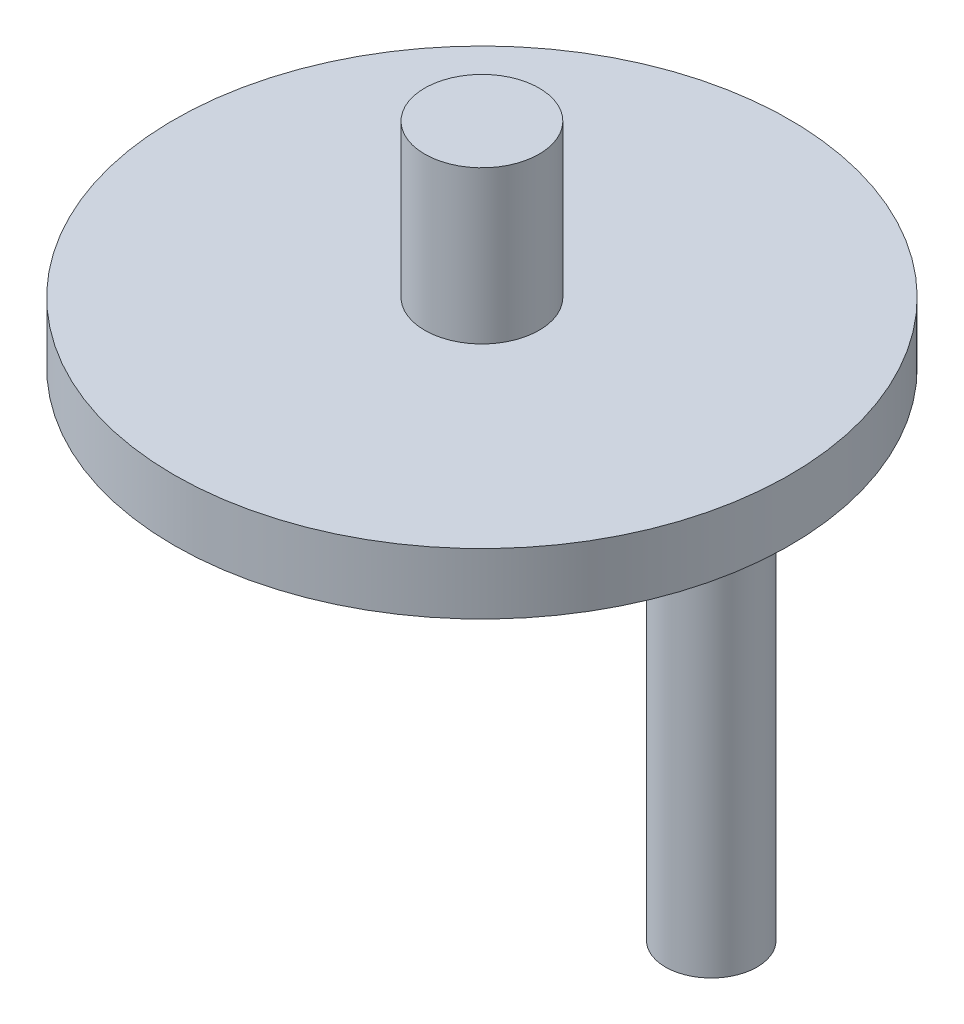
ISO-10303-21;
HEADER;
FILE_DESCRIPTION(('STEP AP214'),'2;1');
FILE_NAME('part.step','',(''),(''),'','','');
FILE_SCHEMA(('AUTOMOTIVE_DESIGN { 1 0 10303 214 1 1 1 1 }'));
ENDSEC;
DATA;
#1=APPLICATION_CONTEXT('core data for automotive mechanical design processes');
#2=APPLICATION_PROTOCOL_DEFINITION('international standard','automotive_design',2000,#1);
#3=PRODUCT_CONTEXT('',#1,'mechanical');
#4=PRODUCT('Part','Part','',(#3));
#5=PRODUCT_RELATED_PRODUCT_CATEGORY('part','',(#4));
#6=PRODUCT_DEFINITION_FORMATION('','',#4);
#7=PRODUCT_DEFINITION_CONTEXT('part definition',#1,'design');
#8=PRODUCT_DEFINITION('design','',#6,#7);
#9=PRODUCT_DEFINITION_SHAPE('','',#8);
#10=(LENGTH_UNIT() NAMED_UNIT(*) SI_UNIT(.MILLI.,.METRE.));
#11=(NAMED_UNIT(*) PLANE_ANGLE_UNIT() SI_UNIT($,.RADIAN.));
#12=(NAMED_UNIT(*) SI_UNIT($,.STERADIAN.) SOLID_ANGLE_UNIT());
#13=UNCERTAINTY_MEASURE_WITH_UNIT(LENGTH_MEASURE(1.E-05),#10,'distance_accuracy_value','');
#14=(GEOMETRIC_REPRESENTATION_CONTEXT(3) GLOBAL_UNCERTAINTY_ASSIGNED_CONTEXT((#13)) GLOBAL_UNIT_ASSIGNED_CONTEXT((#10,
#11,#12)) REPRESENTATION_CONTEXT('',''));
#15=CARTESIAN_POINT('',(0.,0.,0.));
#16=DIRECTION('',(0.,0.,1.));
#17=DIRECTION('',(1.,0.,0.));
#18=AXIS2_PLACEMENT_3D('',#15,#16,#17);
#19=CARTESIAN_POINT('',(0.,-8.,0.));
#20=DIRECTION('',(0.,1.,0.));
#21=DIRECTION('',(0.,0.,1.));
#22=AXIS2_PLACEMENT_3D('',#19,#20,#21);
#23=CYLINDRICAL_SURFACE('',#22,40.34);
#24=CARTESIAN_POINT('',(0.,-8.,0.));
#25=DIRECTION('',(0.,1.,0.));
#26=DIRECTION('',(0.,0.,1.));
#27=AXIS2_PLACEMENT_3D('',#24,#25,#26);
#28=CIRCLE('',#27,40.34);
#29=CARTESIAN_POINT('',(0.,-8.,40.34));
#30=VERTEX_POINT('',#29);
#31=EDGE_CURVE('E99',#30,#30,#28,.T.);
#32=ORIENTED_EDGE('',*,*,#31,.T.);
#33=EDGE_LOOP('',(#32));
#34=FACE_BOUND('',#33,.T.);
#35=CARTESIAN_POINT('',(0.,0.,0.));
#36=DIRECTION('',(0.,1.,0.));
#37=DIRECTION('',(0.,0.,1.));
#38=AXIS2_PLACEMENT_3D('',#35,#36,#37);
#39=CIRCLE('',#38,40.34);
#40=CARTESIAN_POINT('',(0.,0.,40.34));
#41=VERTEX_POINT('',#40);
#42=EDGE_CURVE('E95',#41,#41,#39,.T.);
#43=ORIENTED_EDGE('',*,*,#42,.F.);
#44=EDGE_LOOP('',(#43));
#45=FACE_BOUND('',#44,.T.);
#46=ADVANCED_FACE('F39',(#34,#45),#23,.T.);
#47=CARTESIAN_POINT('',(0.,-8.,0.));
#48=DIRECTION('',(0.,1.,0.));
#49=DIRECTION('',(0.,0.,1.));
#50=AXIS2_PLACEMENT_3D('',#47,#48,#49);
#51=PLANE('',#50);
#52=CARTESIAN_POINT('',(30.06,-8.,0.));
#53=DIRECTION('',(0.,1.,0.));
#54=DIRECTION('',(0.,0.,1.));
#55=AXIS2_PLACEMENT_3D('',#52,#53,#54);
#56=CIRCLE('',#55,5.99999999999999);
#57=CARTESIAN_POINT('',(30.06,-8.,5.99999999999999));
#58=VERTEX_POINT('',#57);
#59=EDGE_CURVE('E11',#58,#58,#56,.F.);
#60=ORIENTED_EDGE('',*,*,#59,.F.);
#61=EDGE_LOOP('',(#60));
#62=FACE_BOUND('',#61,.T.);
#63=CARTESIAN_POINT('',(30.06,-8.,0.));
#64=DIRECTION('',(0.,1.,0.));
#65=DIRECTION('',(0.,0.,-1.));
#66=AXIS2_PLACEMENT_3D('',#63,#64,#65);
#67=CIRCLE('',#66,25.22);
#68=CARTESIAN_POINT('',(11.1037125748503,-8.,-16.6345293607938));
#69=VERTEX_POINT('',#68);
#70=CARTESIAN_POINT('',(11.1037125748503,-8.,16.6345293607938));
#71=VERTEX_POINT('',#70);
#72=EDGE_CURVE('E66',#69,#71,#67,.T.);
#73=ORIENTED_EDGE('',*,*,#72,.F.);
#74=CARTESIAN_POINT('',(0.,-8.,0.));
#75=DIRECTION('',(0.,-1.,0.));
#76=DIRECTION('',(0.,0.,-1.));
#77=AXIS2_PLACEMENT_3D('',#74,#75,#76);
#78=CIRCLE('',#77,20.);
#79=EDGE_CURVE('E53',#71,#69,#78,.T.);
#80=ORIENTED_EDGE('',*,*,#79,.F.);
#81=EDGE_LOOP('',(#73,#80));
#82=FACE_BOUND('',#81,.T.);
#83=ORIENTED_EDGE('',*,*,#31,.F.);
#84=EDGE_LOOP('',(#83));
#85=FACE_BOUND('',#84,.T.);
#86=ADVANCED_FACE('F67',(#62,#82,#85),#51,.F.);
#87=CARTESIAN_POINT('',(0.,0.,0.));
#88=DIRECTION('',(0.,1.,0.));
#89=DIRECTION('',(0.,0.,1.));
#90=AXIS2_PLACEMENT_3D('',#87,#88,#89);
#91=PLANE('',#90);
#92=CARTESIAN_POINT('',(0.,0.,0.));
#93=DIRECTION('',(0.,1.,0.));
#94=DIRECTION('',(0.,0.,1.));
#95=AXIS2_PLACEMENT_3D('',#92,#93,#94);
#96=CIRCLE('',#95,7.5);
#97=CARTESIAN_POINT('',(0.,0.,7.5));
#98=VERTEX_POINT('',#97);
#99=EDGE_CURVE('E47',#98,#98,#96,.T.);
#100=ORIENTED_EDGE('',*,*,#99,.F.);
#101=EDGE_LOOP('',(#100));
#102=FACE_BOUND('',#101,.T.);
#103=ORIENTED_EDGE('',*,*,#42,.T.);
#104=EDGE_LOOP('',(#103));
#105=FACE_BOUND('',#104,.T.);
#106=ADVANCED_FACE('F106',(#102,#105),#91,.T.);
#107=CARTESIAN_POINT('',(0.,20.,0.));
#108=DIRECTION('',(0.,-1.,0.));
#109=DIRECTION('',(0.,0.,-1.));
#110=AXIS2_PLACEMENT_3D('',#107,#108,#109);
#111=CYLINDRICAL_SURFACE('',#110,7.5);
#112=CARTESIAN_POINT('',(0.,20.,0.));
#113=DIRECTION('',(0.,1.,0.));
#114=DIRECTION('',(0.,0.,1.));
#115=AXIS2_PLACEMENT_3D('',#112,#113,#114);
#116=CIRCLE('',#115,7.5);
#117=CARTESIAN_POINT('',(0.,20.,7.5));
#118=VERTEX_POINT('',#117);
#119=EDGE_CURVE('E88',#118,#118,#116,.T.);
#120=ORIENTED_EDGE('',*,*,#119,.F.);
#121=EDGE_LOOP('',(#120));
#122=FACE_BOUND('',#121,.T.);
#123=ORIENTED_EDGE('',*,*,#99,.T.);
#124=EDGE_LOOP('',(#123));
#125=FACE_BOUND('',#124,.T.);
#126=ADVANCED_FACE('F119',(#122,#125),#111,.T.);
#127=CARTESIAN_POINT('',(0.,20.,0.));
#128=DIRECTION('',(0.,1.,0.));
#129=DIRECTION('',(0.,0.,1.));
#130=AXIS2_PLACEMENT_3D('',#127,#128,#129);
#131=PLANE('',#130);
#132=ORIENTED_EDGE('',*,*,#119,.T.);
#133=EDGE_LOOP('',(#132));
#134=FACE_BOUND('',#133,.T.);
#135=ADVANCED_FACE('F125',(#134),#131,.T.);
#136=CARTESIAN_POINT('',(30.06,-18.,0.));
#137=DIRECTION('',(0.,1.,0.));
#138=DIRECTION('',(0.,0.,1.));
#139=AXIS2_PLACEMENT_3D('',#136,#137,#138);
#140=CYLINDRICAL_SURFACE('',#139,25.22);
#141=ORIENTED_EDGE('',*,*,#72,.T.);
#142=DIRECTION('',(0.,1.,0.));
#143=VECTOR('',#142,1.);
#144=CARTESIAN_POINT('',(11.1037125748503,-18.,16.6345293607938));
#145=LINE('',#144,#143);
#146=CARTESIAN_POINT('',(11.1037125748503,-18.,16.6345293607938));
#147=VERTEX_POINT('',#146);
#148=EDGE_CURVE('E79',#147,#71,#145,.T.);
#149=ORIENTED_EDGE('',*,*,#148,.F.);
#150=CARTESIAN_POINT('',(30.06,-18.,0.));
#151=DIRECTION('',(0.,1.,0.));
#152=DIRECTION('',(0.,0.,-1.));
#153=AXIS2_PLACEMENT_3D('',#150,#151,#152);
#154=CIRCLE('',#153,25.22);
#155=CARTESIAN_POINT('',(11.1037125748503,-18.,-16.6345293607938));
#156=VERTEX_POINT('',#155);
#157=EDGE_CURVE('E81',#156,#147,#154,.T.);
#158=ORIENTED_EDGE('',*,*,#157,.F.);
#159=DIRECTION('',(0.,1.,0.));
#160=VECTOR('',#159,1.);
#161=CARTESIAN_POINT('',(11.1037125748503,-18.,-16.6345293607938));
#162=LINE('',#161,#160);
#163=EDGE_CURVE('E77',#156,#69,#162,.T.);
#164=ORIENTED_EDGE('',*,*,#163,.T.);
#165=EDGE_LOOP('',(#141,#149,#158,#164));
#166=FACE_BOUND('',#165,.T.);
#167=ADVANCED_FACE('F83',(#166),#140,.F.);
#168=CARTESIAN_POINT('',(0.,-18.,0.));
#169=DIRECTION('',(0.,1.,0.));
#170=DIRECTION('',(0.,0.,1.));
#171=AXIS2_PLACEMENT_3D('',#168,#169,#170);
#172=CYLINDRICAL_SURFACE('',#171,20.);
#173=ORIENTED_EDGE('',*,*,#79,.T.);
#174=ORIENTED_EDGE('',*,*,#163,.F.);
#175=CARTESIAN_POINT('',(0.,-18.,0.));
#176=DIRECTION('',(0.,-1.,0.));
#177=DIRECTION('',(0.,0.,-1.));
#178=AXIS2_PLACEMENT_3D('',#175,#176,#177);
#179=CIRCLE('',#178,20.);
#180=EDGE_CURVE('E61',#147,#156,#179,.T.);
#181=ORIENTED_EDGE('',*,*,#180,.F.);
#182=ORIENTED_EDGE('',*,*,#148,.T.);
#183=EDGE_LOOP('',(#173,#174,#181,#182));
#184=FACE_BOUND('',#183,.T.);
#185=ADVANCED_FACE('F76',(#184),#172,.T.);
#186=CARTESIAN_POINT('',(15.03,-18.,0.));
#187=DIRECTION('',(0.,-1.,0.));
#188=DIRECTION('',(0.,0.,-1.));
#189=AXIS2_PLACEMENT_3D('',#186,#187,#188);
#190=PLANE('',#189);
#191=ORIENTED_EDGE('',*,*,#157,.T.);
#192=ORIENTED_EDGE('',*,*,#180,.T.);
#193=EDGE_LOOP('',(#191,#192));
#194=FACE_BOUND('',#193,.T.);
#195=ADVANCED_FACE('F134',(#194),#190,.T.);
#196=CARTESIAN_POINT('',(30.06,-58.,0.));
#197=DIRECTION('',(0.,1.,0.));
#198=DIRECTION('',(0.,0.,1.));
#199=AXIS2_PLACEMENT_3D('',#196,#197,#198);
#200=CYLINDRICAL_SURFACE('',#199,5.99999999999999);
#201=CARTESIAN_POINT('',(30.06,-58.,0.));
#202=DIRECTION('',(0.,-1.,0.));
#203=DIRECTION('',(0.,0.,-1.));
#204=AXIS2_PLACEMENT_3D('',#201,#202,#203);
#205=CIRCLE('',#204,5.99999999999999);
#206=CARTESIAN_POINT('',(30.06,-58.,-5.99999999999999));
#207=VERTEX_POINT('',#206);
#208=EDGE_CURVE('E73',#207,#207,#205,.T.);
#209=ORIENTED_EDGE('',*,*,#208,.F.);
#210=EDGE_LOOP('',(#209));
#211=FACE_BOUND('',#210,.T.);
#212=ORIENTED_EDGE('',*,*,#59,.T.);
#213=EDGE_LOOP('',(#212));
#214=FACE_BOUND('',#213,.T.);
#215=ADVANCED_FACE('F137',(#211,#214),#200,.T.);
#216=CARTESIAN_POINT('',(30.06,-58.,0.));
#217=DIRECTION('',(0.,-1.,0.));
#218=DIRECTION('',(0.,0.,-1.));
#219=AXIS2_PLACEMENT_3D('',#216,#217,#218);
#220=PLANE('',#219);
#221=ORIENTED_EDGE('',*,*,#208,.T.);
#222=EDGE_LOOP('',(#221));
#223=FACE_BOUND('',#222,.T.);
#224=ADVANCED_FACE('F140',(#223),#220,.T.);
#225=CLOSED_SHELL('',(#46,#86,#106,#126,#135,#167,#185,#195,#215,#224));
#226=MANIFOLD_SOLID_BREP('B2',#225);
#227=ADVANCED_BREP_SHAPE_REPRESENTATION('',(#18,#226),#14);
#228=SHAPE_DEFINITION_REPRESENTATION(#9,#227);
ENDSEC;
END-ISO-10303-21;
